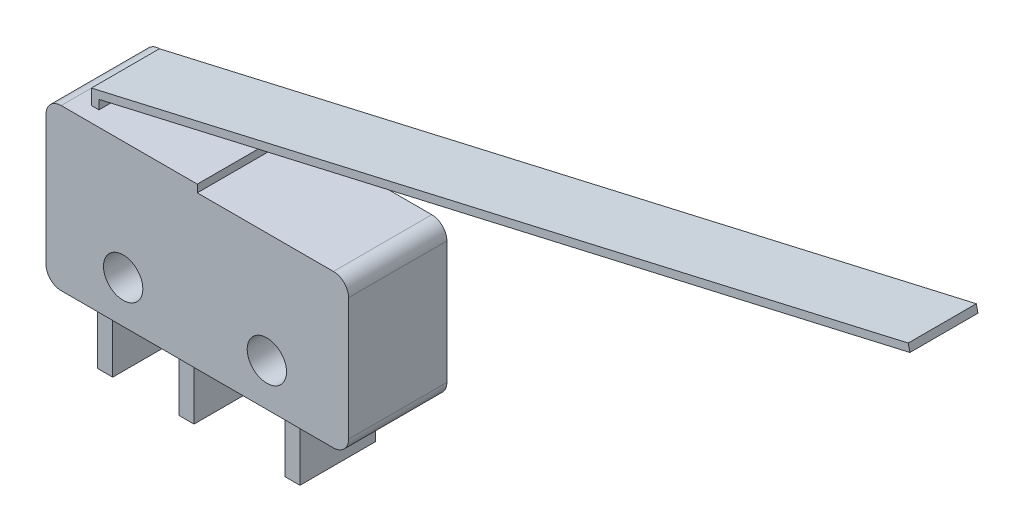
ISO-10303-21;
HEADER;
FILE_DESCRIPTION(('STEP AP214'),'2;1');
FILE_NAME('part.step','',(''),(''),'','','');
FILE_SCHEMA(('AUTOMOTIVE_DESIGN { 1 0 10303 214 1 1 1 1 }'));
ENDSEC;
DATA;
#1=APPLICATION_CONTEXT('core data for automotive mechanical design processes');
#2=APPLICATION_PROTOCOL_DEFINITION('international standard','automotive_design',2000,#1);
#3=PRODUCT_CONTEXT('',#1,'mechanical');
#4=PRODUCT('Part','Part','',(#3));
#5=PRODUCT_RELATED_PRODUCT_CATEGORY('part','',(#4));
#6=PRODUCT_DEFINITION_FORMATION('','',#4);
#7=PRODUCT_DEFINITION_CONTEXT('part definition',#1,'design');
#8=PRODUCT_DEFINITION('design','',#6,#7);
#9=PRODUCT_DEFINITION_SHAPE('','',#8);
#10=(LENGTH_UNIT() NAMED_UNIT(*) SI_UNIT(.MILLI.,.METRE.));
#11=(NAMED_UNIT(*) PLANE_ANGLE_UNIT() SI_UNIT($,.RADIAN.));
#12=(NAMED_UNIT(*) SI_UNIT($,.STERADIAN.) SOLID_ANGLE_UNIT());
#13=UNCERTAINTY_MEASURE_WITH_UNIT(LENGTH_MEASURE(1.E-05),#10,'distance_accuracy_value','');
#14=(GEOMETRIC_REPRESENTATION_CONTEXT(3) GLOBAL_UNCERTAINTY_ASSIGNED_CONTEXT((#13)) GLOBAL_UNIT_ASSIGNED_CONTEXT((#10,
#11,#12)) REPRESENTATION_CONTEXT('',''));
#15=CARTESIAN_POINT('',(0.,0.,0.));
#16=DIRECTION('',(0.,0.,1.));
#17=DIRECTION('',(1.,0.,0.));
#18=AXIS2_PLACEMENT_3D('',#15,#16,#17);
#19=CARTESIAN_POINT('',(0.,0.,6.5));
#20=DIRECTION('',(0.,1.,0.));
#21=DIRECTION('',(0.,0.,1.));
#22=AXIS2_PLACEMENT_3D('',#19,#20,#21);
#23=PLANE('',#22);
#24=DIRECTION('',(0.,0.,-1.));
#25=VECTOR('',#24,1.);
#26=CARTESIAN_POINT('',(8.0313704706211,0.,5.75));
#27=LINE('',#26,#25);
#28=CARTESIAN_POINT('',(8.0313704706211,0.,5.75));
#29=VERTEX_POINT('',#28);
#30=CARTESIAN_POINT('',(8.0313704706211,0.,0.75));
#31=VERTEX_POINT('',#30);
#32=EDGE_CURVE('E303',#29,#31,#27,.T.);
#33=ORIENTED_EDGE('',*,*,#32,.F.);
#34=DIRECTION('',(-1.,0.,0.));
#35=VECTOR('',#34,1.);
#36=CARTESIAN_POINT('',(8.0313704706211,0.,5.75));
#37=LINE('',#36,#35);
#38=CARTESIAN_POINT('',(9.0313704706211,0.,5.75));
#39=VERTEX_POINT('',#38);
#40=EDGE_CURVE('E290',#39,#29,#37,.T.);
#41=ORIENTED_EDGE('',*,*,#40,.F.);
#42=DIRECTION('',(0.,0.,1.));
#43=VECTOR('',#42,1.);
#44=CARTESIAN_POINT('',(9.0313704706211,0.,5.75));
#45=LINE('',#44,#43);
#46=CARTESIAN_POINT('',(9.0313704706211,0.,0.75));
#47=VERTEX_POINT('',#46);
#48=EDGE_CURVE('E294',#47,#39,#45,.T.);
#49=ORIENTED_EDGE('',*,*,#48,.F.);
#50=DIRECTION('',(1.,0.,0.));
#51=VECTOR('',#50,1.);
#52=CARTESIAN_POINT('',(8.0313704706211,0.,0.75));
#53=LINE('',#52,#51);
#54=EDGE_CURVE('E299',#31,#47,#53,.T.);
#55=ORIENTED_EDGE('',*,*,#54,.F.);
#56=EDGE_LOOP('',(#33,#41,#49,#55));
#57=FACE_BOUND('',#56,.T.);
#58=DIRECTION('',(1.,0.,0.));
#59=VECTOR('',#58,1.);
#60=CARTESIAN_POINT('',(0.,0.,6.5));
#61=LINE('',#60,#59);
#62=CARTESIAN_POINT('',(1.,0.,6.5));
#63=VERTEX_POINT('',#62);
#64=CARTESIAN_POINT('',(19.,0.,6.5));
#65=VERTEX_POINT('',#64);
#66=EDGE_CURVE('E450',#63,#65,#61,.T.);
#67=ORIENTED_EDGE('',*,*,#66,.F.);
#68=DIRECTION('',(0.,0.,-1.));
#69=VECTOR('',#68,1.);
#70=CARTESIAN_POINT('',(1.,0.,6.5));
#71=LINE('',#70,#69);
#72=CARTESIAN_POINT('',(1.,0.,0.));
#73=VERTEX_POINT('',#72);
#74=EDGE_CURVE('E534',#63,#73,#71,.T.);
#75=ORIENTED_EDGE('',*,*,#74,.T.);
#76=DIRECTION('',(1.,0.,0.));
#77=VECTOR('',#76,1.);
#78=CARTESIAN_POINT('',(0.,0.,0.));
#79=LINE('',#78,#77);
#80=CARTESIAN_POINT('',(19.,0.,0.));
#81=VERTEX_POINT('',#80);
#82=EDGE_CURVE('E473',#73,#81,#79,.T.);
#83=ORIENTED_EDGE('',*,*,#82,.T.);
#84=DIRECTION('',(0.,0.,-1.));
#85=VECTOR('',#84,1.);
#86=CARTESIAN_POINT('',(19.,0.,6.5));
#87=LINE('',#86,#85);
#88=EDGE_CURVE('E531',#81,#65,#87,.F.);
#89=ORIENTED_EDGE('',*,*,#88,.T.);
#90=EDGE_LOOP('',(#67,#75,#83,#89));
#91=FACE_BOUND('',#90,.T.);
#92=DIRECTION('',(0.,0.,-1.));
#93=VECTOR('',#92,1.);
#94=CARTESIAN_POINT('',(2.65900909777777,0.,5.75));
#95=LINE('',#94,#93);
#96=CARTESIAN_POINT('',(2.65900909777777,0.,5.75));
#97=VERTEX_POINT('',#96);
#98=CARTESIAN_POINT('',(2.65900909777777,0.,0.75));
#99=VERTEX_POINT('',#98);
#100=EDGE_CURVE('E307',#97,#99,#95,.T.);
#101=ORIENTED_EDGE('',*,*,#100,.F.);
#102=DIRECTION('',(-1.,0.,0.));
#103=VECTOR('',#102,1.);
#104=CARTESIAN_POINT('',(2.65900909777777,0.,5.75));
#105=LINE('',#104,#103);
#106=CARTESIAN_POINT('',(3.65900909777777,0.,5.75));
#107=VERTEX_POINT('',#106);
#108=EDGE_CURVE('E324',#107,#97,#105,.T.);
#109=ORIENTED_EDGE('',*,*,#108,.F.);
#110=DIRECTION('',(0.,0.,1.));
#111=VECTOR('',#110,1.);
#112=CARTESIAN_POINT('',(3.65900909777777,0.,5.75));
#113=LINE('',#112,#111);
#114=CARTESIAN_POINT('',(3.65900909777777,0.,0.75));
#115=VERTEX_POINT('',#114);
#116=EDGE_CURVE('E341',#115,#107,#113,.T.);
#117=ORIENTED_EDGE('',*,*,#116,.F.);
#118=DIRECTION('',(1.,0.,0.));
#119=VECTOR('',#118,1.);
#120=CARTESIAN_POINT('',(2.65900909777777,0.,0.75));
#121=LINE('',#120,#119);
#122=EDGE_CURVE('E337',#99,#115,#121,.T.);
#123=ORIENTED_EDGE('',*,*,#122,.F.);
#124=EDGE_LOOP('',(#101,#109,#117,#123));
#125=FACE_BOUND('',#124,.T.);
#126=DIRECTION('',(0.,0.,-1.));
#127=VECTOR('',#126,1.);
#128=CARTESIAN_POINT('',(15.0359206095109,0.,5.75));
#129=LINE('',#128,#127);
#130=CARTESIAN_POINT('',(15.0359206095109,0.,5.75));
#131=VERTEX_POINT('',#130);
#132=CARTESIAN_POINT('',(15.0359206095109,0.,0.75));
#133=VERTEX_POINT('',#132);
#134=EDGE_CURVE('E229',#131,#133,#129,.T.);
#135=ORIENTED_EDGE('',*,*,#134,.F.);
#136=DIRECTION('',(-1.,0.,0.));
#137=VECTOR('',#136,1.);
#138=CARTESIAN_POINT('',(15.0359206095109,0.,5.75));
#139=LINE('',#138,#137);
#140=CARTESIAN_POINT('',(16.0359206095109,0.,5.75));
#141=VERTEX_POINT('',#140);
#142=EDGE_CURVE('E231',#141,#131,#139,.T.);
#143=ORIENTED_EDGE('',*,*,#142,.F.);
#144=DIRECTION('',(0.,0.,1.));
#145=VECTOR('',#144,1.);
#146=CARTESIAN_POINT('',(16.0359206095109,0.,5.75));
#147=LINE('',#146,#145);
#148=CARTESIAN_POINT('',(16.0359206095109,0.,0.75));
#149=VERTEX_POINT('',#148);
#150=EDGE_CURVE('E68',#149,#141,#147,.T.);
#151=ORIENTED_EDGE('',*,*,#150,.F.);
#152=DIRECTION('',(1.,0.,0.));
#153=VECTOR('',#152,1.);
#154=CARTESIAN_POINT('',(15.0359206095109,0.,0.75));
#155=LINE('',#154,#153);
#156=EDGE_CURVE('E63',#133,#149,#155,.T.);
#157=ORIENTED_EDGE('',*,*,#156,.F.);
#158=EDGE_LOOP('',(#135,#143,#151,#157));
#159=FACE_BOUND('',#158,.T.);
#160=ADVANCED_FACE('F47',(#57,#91,#125,#159),#23,.F.);
#161=CARTESIAN_POINT('',(0.,0.,6.5));
#162=DIRECTION('',(1.,0.,0.));
#163=DIRECTION('',(0.,0.,-1.));
#164=AXIS2_PLACEMENT_3D('',#161,#162,#163);
#165=PLANE('',#164);
#166=DIRECTION('',(0.,-1.,0.));
#167=VECTOR('',#166,1.);
#168=CARTESIAN_POINT('',(0.,0.,6.5));
#169=LINE('',#168,#167);
#170=CARTESIAN_POINT('',(0.,9.6,6.5));
#171=VERTEX_POINT('',#170);
#172=CARTESIAN_POINT('',(0.,1.,6.5));
#173=VERTEX_POINT('',#172);
#174=EDGE_CURVE('E446',#171,#173,#169,.T.);
#175=ORIENTED_EDGE('',*,*,#174,.F.);
#176=DIRECTION('',(0.,0.,-1.));
#177=VECTOR('',#176,1.);
#178=CARTESIAN_POINT('',(0.,9.6,6.5));
#179=LINE('',#178,#177);
#180=CARTESIAN_POINT('',(0.,9.6,0.));
#181=VERTEX_POINT('',#180);
#182=EDGE_CURVE('E500',#171,#181,#179,.T.);
#183=ORIENTED_EDGE('',*,*,#182,.T.);
#184=DIRECTION('',(0.,-1.,0.));
#185=VECTOR('',#184,1.);
#186=CARTESIAN_POINT('',(0.,0.,0.));
#187=LINE('',#186,#185);
#188=CARTESIAN_POINT('',(0.,1.,0.));
#189=VERTEX_POINT('',#188);
#190=EDGE_CURVE('E445',#181,#189,#187,.T.);
#191=ORIENTED_EDGE('',*,*,#190,.T.);
#192=DIRECTION('',(0.,0.,-1.));
#193=VECTOR('',#192,1.);
#194=CARTESIAN_POINT('',(0.,1.,6.5));
#195=LINE('',#194,#193);
#196=EDGE_CURVE('E497',#189,#173,#195,.F.);
#197=ORIENTED_EDGE('',*,*,#196,.T.);
#198=EDGE_LOOP('',(#175,#183,#191,#197));
#199=FACE_BOUND('',#198,.T.);
#200=ADVANCED_FACE('F577',(#199),#165,.F.);
#201=CARTESIAN_POINT('',(20.,0.,6.5));
#202=DIRECTION('',(-1.,0.,0.));
#203=DIRECTION('',(0.,0.,1.));
#204=AXIS2_PLACEMENT_3D('',#201,#202,#203);
#205=PLANE('',#204);
#206=DIRECTION('',(0.,1.,0.));
#207=VECTOR('',#206,1.);
#208=CARTESIAN_POINT('',(20.,0.,6.5));
#209=LINE('',#208,#207);
#210=CARTESIAN_POINT('',(20.,1.,6.5));
#211=VERTEX_POINT('',#210);
#212=CARTESIAN_POINT('',(20.,9.1,6.5));
#213=VERTEX_POINT('',#212);
#214=EDGE_CURVE('E455',#211,#213,#209,.T.);
#215=ORIENTED_EDGE('',*,*,#214,.F.);
#216=DIRECTION('',(0.,0.,-1.));
#217=VECTOR('',#216,1.);
#218=CARTESIAN_POINT('',(20.,1.,6.5));
#219=LINE('',#218,#217);
#220=CARTESIAN_POINT('',(20.,1.,0.));
#221=VERTEX_POINT('',#220);
#222=EDGE_CURVE('E56',#211,#221,#219,.T.);
#223=ORIENTED_EDGE('',*,*,#222,.T.);
#224=DIRECTION('',(0.,1.,0.));
#225=VECTOR('',#224,1.);
#226=CARTESIAN_POINT('',(20.,0.,0.));
#227=LINE('',#226,#225);
#228=CARTESIAN_POINT('',(20.,9.1,0.));
#229=VERTEX_POINT('',#228);
#230=EDGE_CURVE('E477',#221,#229,#227,.T.);
#231=ORIENTED_EDGE('',*,*,#230,.T.);
#232=DIRECTION('',(0.,0.,-1.));
#233=VECTOR('',#232,1.);
#234=CARTESIAN_POINT('',(20.,9.1,6.5));
#235=LINE('',#234,#233);
#236=EDGE_CURVE('E538',#229,#213,#235,.F.);
#237=ORIENTED_EDGE('',*,*,#236,.T.);
#238=EDGE_LOOP('',(#215,#223,#231,#237));
#239=FACE_BOUND('',#238,.T.);
#240=ADVANCED_FACE('F546',(#239),#205,.F.);
#241=CARTESIAN_POINT('',(10.,10.1,6.5));
#242=DIRECTION('',(0.,-1.,0.));
#243=DIRECTION('',(0.,0.,-1.));
#244=AXIS2_PLACEMENT_3D('',#241,#242,#243);
#245=PLANE('',#244);
#246=DIRECTION('',(-1.,0.,0.));
#247=VECTOR('',#246,1.);
#248=CARTESIAN_POINT('',(10.,10.1,6.5));
#249=LINE('',#248,#247);
#250=CARTESIAN_POINT('',(19.,10.1,6.5));
#251=VERTEX_POINT('',#250);
#252=CARTESIAN_POINT('',(10.,10.1,6.5));
#253=VERTEX_POINT('',#252);
#254=EDGE_CURVE('E459',#251,#253,#249,.T.);
#255=ORIENTED_EDGE('',*,*,#254,.F.);
#256=DIRECTION('',(0.,0.,-1.));
#257=VECTOR('',#256,1.);
#258=CARTESIAN_POINT('',(19.,10.1,6.5));
#259=LINE('',#258,#257);
#260=CARTESIAN_POINT('',(19.,10.1,0.));
#261=VERTEX_POINT('',#260);
#262=EDGE_CURVE('E12',#251,#261,#259,.T.);
#263=ORIENTED_EDGE('',*,*,#262,.T.);
#264=DIRECTION('',(-1.,0.,0.));
#265=VECTOR('',#264,1.);
#266=CARTESIAN_POINT('',(10.,10.1,0.));
#267=LINE('',#266,#265);
#268=CARTESIAN_POINT('',(10.,10.1,0.));
#269=VERTEX_POINT('',#268);
#270=EDGE_CURVE('E481',#261,#269,#267,.T.);
#271=ORIENTED_EDGE('',*,*,#270,.T.);
#272=DIRECTION('',(0.,0.,-1.));
#273=VECTOR('',#272,1.);
#274=CARTESIAN_POINT('',(10.,10.1,6.5));
#275=LINE('',#274,#273);
#276=EDGE_CURVE('E493',#253,#269,#275,.T.);
#277=ORIENTED_EDGE('',*,*,#276,.F.);
#278=EDGE_LOOP('',(#255,#263,#271,#277));
#279=FACE_BOUND('',#278,.T.);
#280=ADVANCED_FACE('F561',(#279),#245,.F.);
#281=CARTESIAN_POINT('',(10.,10.6,6.5));
#282=DIRECTION('',(-1.,0.,0.));
#283=DIRECTION('',(0.,0.,1.));
#284=AXIS2_PLACEMENT_3D('',#281,#282,#283);
#285=PLANE('',#284);
#286=DIRECTION('',(0.,1.,0.));
#287=VECTOR('',#286,1.);
#288=CARTESIAN_POINT('',(10.,10.6,0.));
#289=LINE('',#288,#287);
#290=CARTESIAN_POINT('',(10.,10.6,0.));
#291=VERTEX_POINT('',#290);
#292=EDGE_CURVE('E484',#269,#291,#289,.T.);
#293=ORIENTED_EDGE('',*,*,#292,.T.);
#294=DIRECTION('',(0.,0.,-1.));
#295=VECTOR('',#294,1.);
#296=CARTESIAN_POINT('',(10.,10.6,6.5));
#297=LINE('',#296,#295);
#298=CARTESIAN_POINT('',(10.,10.6,6.5));
#299=VERTEX_POINT('',#298);
#300=EDGE_CURVE('E469',#299,#291,#297,.T.);
#301=ORIENTED_EDGE('',*,*,#300,.F.);
#302=DIRECTION('',(0.,1.,0.));
#303=VECTOR('',#302,1.);
#304=CARTESIAN_POINT('',(10.,10.6,6.5));
#305=LINE('',#304,#303);
#306=EDGE_CURVE('E462',#253,#299,#305,.T.);
#307=ORIENTED_EDGE('',*,*,#306,.F.);
#308=ORIENTED_EDGE('',*,*,#276,.T.);
#309=EDGE_LOOP('',(#293,#301,#307,#308));
#310=FACE_BOUND('',#309,.T.);
#311=ADVANCED_FACE('F590',(#310),#285,.F.);
#312=CARTESIAN_POINT('',(0.,10.6,6.5));
#313=DIRECTION('',(0.,-1.,0.));
#314=DIRECTION('',(0.,0.,-1.));
#315=AXIS2_PLACEMENT_3D('',#312,#313,#314);
#316=PLANE('',#315);
#317=DIRECTION('',(1.,0.,0.));
#318=VECTOR('',#317,1.);
#319=CARTESIAN_POINT('',(2.,10.6,1.));
#320=LINE('',#319,#318);
#321=CARTESIAN_POINT('',(2.,10.6,1.));
#322=VERTEX_POINT('',#321);
#323=CARTESIAN_POINT('',(2.5,10.6,1.));
#324=VERTEX_POINT('',#323);
#325=EDGE_CURVE('E392',#322,#324,#320,.T.);
#326=ORIENTED_EDGE('',*,*,#325,.T.);
#327=DIRECTION('',(0.,0.,1.));
#328=VECTOR('',#327,1.);
#329=CARTESIAN_POINT('',(2.5,10.6,-55.7391865797012));
#330=LINE('',#329,#328);
#331=CARTESIAN_POINT('',(2.5,10.6,5.5));
#332=VERTEX_POINT('',#331);
#333=EDGE_CURVE('E396',#324,#332,#330,.T.);
#334=ORIENTED_EDGE('',*,*,#333,.T.);
#335=DIRECTION('',(1.,0.,0.));
#336=VECTOR('',#335,1.);
#337=CARTESIAN_POINT('',(2.,10.6,5.5));
#338=LINE('',#337,#336);
#339=CARTESIAN_POINT('',(2.,10.6,5.5));
#340=VERTEX_POINT('',#339);
#341=EDGE_CURVE('E363',#340,#332,#338,.T.);
#342=ORIENTED_EDGE('',*,*,#341,.F.);
#343=DIRECTION('',(0.,0.,1.));
#344=VECTOR('',#343,1.);
#345=CARTESIAN_POINT('',(2.,10.6,-55.7391865797012));
#346=LINE('',#345,#344);
#347=EDGE_CURVE('E397',#322,#340,#346,.T.);
#348=ORIENTED_EDGE('',*,*,#347,.F.);
#349=EDGE_LOOP('',(#326,#334,#342,#348));
#350=FACE_BOUND('',#349,.T.);
#351=DIRECTION('',(-1.,0.,0.));
#352=VECTOR('',#351,1.);
#353=CARTESIAN_POINT('',(0.,10.6,0.));
#354=LINE('',#353,#352);
#355=CARTESIAN_POINT('',(1.,10.6,0.));
#356=VERTEX_POINT('',#355);
#357=EDGE_CURVE('E451',#291,#356,#354,.T.);
#358=ORIENTED_EDGE('',*,*,#357,.T.);
#359=DIRECTION('',(0.,0.,-1.));
#360=VECTOR('',#359,1.);
#361=CARTESIAN_POINT('',(1.,10.6,6.5));
#362=LINE('',#361,#360);
#363=CARTESIAN_POINT('',(1.,10.6,6.5));
#364=VERTEX_POINT('',#363);
#365=EDGE_CURVE('E516',#356,#364,#362,.F.);
#366=ORIENTED_EDGE('',*,*,#365,.T.);
#367=DIRECTION('',(-1.,0.,0.));
#368=VECTOR('',#367,1.);
#369=CARTESIAN_POINT('',(0.,10.6,6.5));
#370=LINE('',#369,#368);
#371=EDGE_CURVE('E465',#299,#364,#370,.T.);
#372=ORIENTED_EDGE('',*,*,#371,.F.);
#373=ORIENTED_EDGE('',*,*,#300,.T.);
#374=EDGE_LOOP('',(#358,#366,#372,#373));
#375=FACE_BOUND('',#374,.T.);
#376=ADVANCED_FACE('F587',(#350,#375),#316,.F.);
#377=CARTESIAN_POINT('',(0.,0.,6.5));
#378=DIRECTION('',(0.,0.,-1.));
#379=DIRECTION('',(-1.,0.,0.));
#380=AXIS2_PLACEMENT_3D('',#377,#378,#379);
#381=PLANE('',#380);
#382=CARTESIAN_POINT('',(5.1,2.8,6.5));
#383=DIRECTION('',(0.,0.,1.));
#384=DIRECTION('',(1.,0.,0.));
#385=AXIS2_PLACEMENT_3D('',#382,#383,#384);
#386=CIRCLE('',#385,1.3);
#387=CARTESIAN_POINT('',(6.4,2.8,6.5));
#388=VERTEX_POINT('',#387);
#389=EDGE_CURVE('E429',#388,#388,#386,.T.);
#390=ORIENTED_EDGE('',*,*,#389,.F.);
#391=EDGE_LOOP('',(#390));
#392=FACE_BOUND('',#391,.T.);
#393=CARTESIAN_POINT('',(14.6,2.8,6.5));
#394=DIRECTION('',(0.,0.,1.));
#395=DIRECTION('',(1.,0.,0.));
#396=AXIS2_PLACEMENT_3D('',#393,#394,#395);
#397=CIRCLE('',#396,1.3);
#398=CARTESIAN_POINT('',(15.9,2.8,6.5));
#399=VERTEX_POINT('',#398);
#400=EDGE_CURVE('E437',#399,#399,#397,.T.);
#401=ORIENTED_EDGE('',*,*,#400,.F.);
#402=EDGE_LOOP('',(#401));
#403=FACE_BOUND('',#402,.T.);
#404=ORIENTED_EDGE('',*,*,#371,.T.);
#405=CARTESIAN_POINT('',(1.,9.6,6.5));
#406=DIRECTION('',(0.,0.,-1.));
#407=DIRECTION('',(-1.,0.,0.));
#408=AXIS2_PLACEMENT_3D('',#405,#406,#407);
#409=CIRCLE('',#408,1.);
#410=EDGE_CURVE('E528',#364,#171,#409,.F.);
#411=ORIENTED_EDGE('',*,*,#410,.T.);
#412=ORIENTED_EDGE('',*,*,#174,.T.);
#413=CARTESIAN_POINT('',(1.,1.,6.5));
#414=DIRECTION('',(0.,0.,-1.));
#415=DIRECTION('',(-1.,0.,0.));
#416=AXIS2_PLACEMENT_3D('',#413,#414,#415);
#417=CIRCLE('',#416,1.);
#418=EDGE_CURVE('E525',#173,#63,#417,.F.);
#419=ORIENTED_EDGE('',*,*,#418,.T.);
#420=ORIENTED_EDGE('',*,*,#66,.T.);
#421=CARTESIAN_POINT('',(19.,1.,6.5));
#422=DIRECTION('',(0.,0.,-1.));
#423=DIRECTION('',(-1.,0.,0.));
#424=AXIS2_PLACEMENT_3D('',#421,#422,#423);
#425=CIRCLE('',#424,1.);
#426=EDGE_CURVE('E522',#65,#211,#425,.F.);
#427=ORIENTED_EDGE('',*,*,#426,.T.);
#428=ORIENTED_EDGE('',*,*,#214,.T.);
#429=CARTESIAN_POINT('',(19.,9.1,6.5));
#430=DIRECTION('',(0.,0.,-1.));
#431=DIRECTION('',(-1.,0.,0.));
#432=AXIS2_PLACEMENT_3D('',#429,#430,#431);
#433=CIRCLE('',#432,1.);
#434=EDGE_CURVE('E519',#213,#251,#433,.F.);
#435=ORIENTED_EDGE('',*,*,#434,.T.);
#436=ORIENTED_EDGE('',*,*,#254,.T.);
#437=ORIENTED_EDGE('',*,*,#306,.T.);
#438=EDGE_LOOP('',(#404,#411,#412,#419,#420,#427,#428,#435,#436,#437));
#439=FACE_BOUND('',#438,.T.);
#440=ADVANCED_FACE('F565',(#392,#403,#439),#381,.F.);
#441=CARTESIAN_POINT('',(0.,0.,0.));
#442=DIRECTION('',(0.,0.,-1.));
#443=DIRECTION('',(-1.,0.,0.));
#444=AXIS2_PLACEMENT_3D('',#441,#442,#443);
#445=PLANE('',#444);
#446=CARTESIAN_POINT('',(5.1,2.8,0.));
#447=DIRECTION('',(0.,0.,1.));
#448=DIRECTION('',(1.,0.,0.));
#449=AXIS2_PLACEMENT_3D('',#446,#447,#448);
#450=CIRCLE('',#449,1.3);
#451=CARTESIAN_POINT('',(6.4,2.8,0.));
#452=VERTEX_POINT('',#451);
#453=EDGE_CURVE('E433',#452,#452,#450,.T.);
#454=ORIENTED_EDGE('',*,*,#453,.T.);
#455=EDGE_LOOP('',(#454));
#456=FACE_BOUND('',#455,.T.);
#457=CARTESIAN_POINT('',(14.6,2.8,0.));
#458=DIRECTION('',(0.,0.,1.));
#459=DIRECTION('',(1.,0.,0.));
#460=AXIS2_PLACEMENT_3D('',#457,#458,#459);
#461=CIRCLE('',#460,1.3);
#462=CARTESIAN_POINT('',(15.9,2.8,0.));
#463=VERTEX_POINT('',#462);
#464=EDGE_CURVE('E441',#463,#463,#461,.T.);
#465=ORIENTED_EDGE('',*,*,#464,.T.);
#466=EDGE_LOOP('',(#465));
#467=FACE_BOUND('',#466,.T.);
#468=ORIENTED_EDGE('',*,*,#190,.F.);
#469=CARTESIAN_POINT('',(1.,9.6,0.));
#470=DIRECTION('',(0.,0.,-1.));
#471=DIRECTION('',(-1.,0.,0.));
#472=AXIS2_PLACEMENT_3D('',#469,#470,#471);
#473=CIRCLE('',#472,1.);
#474=EDGE_CURVE('E513',#181,#356,#473,.T.);
#475=ORIENTED_EDGE('',*,*,#474,.T.);
#476=ORIENTED_EDGE('',*,*,#357,.F.);
#477=ORIENTED_EDGE('',*,*,#292,.F.);
#478=ORIENTED_EDGE('',*,*,#270,.F.);
#479=CARTESIAN_POINT('',(19.,9.1,0.));
#480=DIRECTION('',(0.,0.,-1.));
#481=DIRECTION('',(-1.,0.,0.));
#482=AXIS2_PLACEMENT_3D('',#479,#480,#481);
#483=CIRCLE('',#482,1.);
#484=EDGE_CURVE('E504',#261,#229,#483,.T.);
#485=ORIENTED_EDGE('',*,*,#484,.T.);
#486=ORIENTED_EDGE('',*,*,#230,.F.);
#487=CARTESIAN_POINT('',(19.,1.,0.));
#488=DIRECTION('',(0.,0.,-1.));
#489=DIRECTION('',(-1.,0.,0.));
#490=AXIS2_PLACEMENT_3D('',#487,#488,#489);
#491=CIRCLE('',#490,1.);
#492=EDGE_CURVE('E507',#221,#81,#491,.T.);
#493=ORIENTED_EDGE('',*,*,#492,.T.);
#494=ORIENTED_EDGE('',*,*,#82,.F.);
#495=CARTESIAN_POINT('',(1.,1.,0.));
#496=DIRECTION('',(0.,0.,-1.));
#497=DIRECTION('',(-1.,0.,0.));
#498=AXIS2_PLACEMENT_3D('',#495,#496,#497);
#499=CIRCLE('',#498,1.);
#500=EDGE_CURVE('E510',#73,#189,#499,.T.);
#501=ORIENTED_EDGE('',*,*,#500,.T.);
#502=EDGE_LOOP('',(#468,#475,#476,#477,#478,#485,#486,#493,#494,#501));
#503=FACE_BOUND('',#502,.T.);
#504=ADVANCED_FACE('F552',(#456,#467,#503),#445,.T.);
#505=CARTESIAN_POINT('',(1.,9.6,6.5));
#506=DIRECTION('',(0.,0.,-1.));
#507=DIRECTION('',(-1.,0.,0.));
#508=AXIS2_PLACEMENT_3D('',#505,#506,#507);
#509=CYLINDRICAL_SURFACE('',#508,1.);
#510=ORIENTED_EDGE('',*,*,#410,.F.);
#511=ORIENTED_EDGE('',*,*,#365,.F.);
#512=ORIENTED_EDGE('',*,*,#474,.F.);
#513=ORIENTED_EDGE('',*,*,#182,.F.);
#514=EDGE_LOOP('',(#510,#511,#512,#513));
#515=FACE_BOUND('',#514,.T.);
#516=ADVANCED_FACE('F583',(#515),#509,.T.);
#517=CARTESIAN_POINT('',(1.,1.,6.5));
#518=DIRECTION('',(0.,0.,-1.));
#519=DIRECTION('',(-1.,0.,0.));
#520=AXIS2_PLACEMENT_3D('',#517,#518,#519);
#521=CYLINDRICAL_SURFACE('',#520,1.);
#522=ORIENTED_EDGE('',*,*,#418,.F.);
#523=ORIENTED_EDGE('',*,*,#196,.F.);
#524=ORIENTED_EDGE('',*,*,#500,.F.);
#525=ORIENTED_EDGE('',*,*,#74,.F.);
#526=EDGE_LOOP('',(#522,#523,#524,#525));
#527=FACE_BOUND('',#526,.T.);
#528=ADVANCED_FACE('F580',(#527),#521,.T.);
#529=CARTESIAN_POINT('',(19.,1.,6.5));
#530=DIRECTION('',(0.,0.,-1.));
#531=DIRECTION('',(-1.,0.,0.));
#532=AXIS2_PLACEMENT_3D('',#529,#530,#531);
#533=CYLINDRICAL_SURFACE('',#532,1.);
#534=ORIENTED_EDGE('',*,*,#426,.F.);
#535=ORIENTED_EDGE('',*,*,#88,.F.);
#536=ORIENTED_EDGE('',*,*,#492,.F.);
#537=ORIENTED_EDGE('',*,*,#222,.F.);
#538=EDGE_LOOP('',(#534,#535,#536,#537));
#539=FACE_BOUND('',#538,.T.);
#540=ADVANCED_FACE('F569',(#539),#533,.T.);
#541=CARTESIAN_POINT('',(19.,9.1,6.5));
#542=DIRECTION('',(0.,0.,-1.));
#543=DIRECTION('',(-1.,0.,0.));
#544=AXIS2_PLACEMENT_3D('',#541,#542,#543);
#545=CYLINDRICAL_SURFACE('',#544,1.);
#546=ORIENTED_EDGE('',*,*,#434,.F.);
#547=ORIENTED_EDGE('',*,*,#236,.F.);
#548=ORIENTED_EDGE('',*,*,#484,.F.);
#549=ORIENTED_EDGE('',*,*,#262,.F.);
#550=EDGE_LOOP('',(#546,#547,#548,#549));
#551=FACE_BOUND('',#550,.T.);
#552=ADVANCED_FACE('F49',(#551),#545,.T.);
#553=CARTESIAN_POINT('',(14.6,2.8,6.5));
#554=DIRECTION('',(0.,0.,1.));
#555=DIRECTION('',(1.,0.,0.));
#556=AXIS2_PLACEMENT_3D('',#553,#554,#555);
#557=CYLINDRICAL_SURFACE('',#556,1.3);
#558=ORIENTED_EDGE('',*,*,#464,.F.);
#559=EDGE_LOOP('',(#558));
#560=FACE_BOUND('',#559,.T.);
#561=ORIENTED_EDGE('',*,*,#400,.T.);
#562=EDGE_LOOP('',(#561));
#563=FACE_BOUND('',#562,.T.);
#564=ADVANCED_FACE('F618',(#560,#563),#557,.F.);
#565=CARTESIAN_POINT('',(5.1,2.8,6.5));
#566=DIRECTION('',(0.,0.,1.));
#567=DIRECTION('',(1.,0.,0.));
#568=AXIS2_PLACEMENT_3D('',#565,#566,#567);
#569=CYLINDRICAL_SURFACE('',#568,1.3);
#570=ORIENTED_EDGE('',*,*,#453,.F.);
#571=EDGE_LOOP('',(#570));
#572=FACE_BOUND('',#571,.T.);
#573=ORIENTED_EDGE('',*,*,#389,.T.);
#574=EDGE_LOOP('',(#573));
#575=FACE_BOUND('',#574,.T.);
#576=ADVANCED_FACE('F623',(#572,#575),#569,.F.);
#577=CARTESIAN_POINT('',(0.,0.,1.));
#578=DIRECTION('',(0.,0.,-1.));
#579=DIRECTION('',(-1.,0.,0.));
#580=AXIS2_PLACEMENT_3D('',#577,#578,#579);
#581=PLANE('',#580);
#582=ORIENTED_EDGE('',*,*,#325,.F.);
#583=DIRECTION('',(0.,-1.,0.));
#584=VECTOR('',#583,1.);
#585=CARTESIAN_POINT('',(2.,11.6,1.));
#586=LINE('',#585,#584);
#587=CARTESIAN_POINT('',(2.,11.6,1.));
#588=VERTEX_POINT('',#587);
#589=EDGE_CURVE('E398',#588,#322,#586,.T.);
#590=ORIENTED_EDGE('',*,*,#589,.F.);
#591=DIRECTION('',(-0.974627272780493,-0.223834043774532,0.));
#592=VECTOR('',#591,1.);
#593=CARTESIAN_POINT('',(55.9925829810398,24.,1.));
#594=LINE('',#593,#592);
#595=CARTESIAN_POINT('',(55.9925829810398,24.,1.));
#596=VERTEX_POINT('',#595);
#597=EDGE_CURVE('E402',#596,#588,#594,.T.);
#598=ORIENTED_EDGE('',*,*,#597,.F.);
#599=DIRECTION('',(-0.223834043774532,0.974627272780493,0.));
#600=VECTOR('',#599,1.);
#601=CARTESIAN_POINT('',(56.1045000029271,23.5126863636098,1.));
#602=LINE('',#601,#600);
#603=CARTESIAN_POINT('',(56.1045000029271,23.5126863636098,1.));
#604=VERTEX_POINT('',#603);
#605=EDGE_CURVE('E407',#604,#596,#602,.T.);
#606=ORIENTED_EDGE('',*,*,#605,.F.);
#607=DIRECTION('',(0.974627272780493,0.223834043774532,0.));
#608=VECTOR('',#607,1.);
#609=CARTESIAN_POINT('',(2.5,11.2018139560105,1.));
#610=LINE('',#609,#608);
#611=CARTESIAN_POINT('',(2.5,11.2018139560105,1.));
#612=VERTEX_POINT('',#611);
#613=EDGE_CURVE('E412',#612,#604,#610,.T.);
#614=ORIENTED_EDGE('',*,*,#613,.F.);
#615=DIRECTION('',(0.,1.,0.));
#616=VECTOR('',#615,1.);
#617=CARTESIAN_POINT('',(2.5,10.6,1.));
#618=LINE('',#617,#616);
#619=EDGE_CURVE('E368',#324,#612,#618,.T.);
#620=ORIENTED_EDGE('',*,*,#619,.F.);
#621=EDGE_LOOP('',(#582,#590,#598,#606,#614,#620));
#622=FACE_BOUND('',#621,.T.);
#623=ADVANCED_FACE('F630',(#622),#581,.T.);
#624=CARTESIAN_POINT('',(0.,0.,5.5));
#625=DIRECTION('',(0.,0.,1.));
#626=DIRECTION('',(1.,0.,0.));
#627=AXIS2_PLACEMENT_3D('',#624,#625,#626);
#628=PLANE('',#627);
#629=ORIENTED_EDGE('',*,*,#341,.T.);
#630=DIRECTION('',(0.,1.,0.));
#631=VECTOR('',#630,1.);
#632=CARTESIAN_POINT('',(2.5,10.6,5.5));
#633=LINE('',#632,#631);
#634=CARTESIAN_POINT('',(2.5,11.2018139560105,5.5));
#635=VERTEX_POINT('',#634);
#636=EDGE_CURVE('E381',#332,#635,#633,.T.);
#637=ORIENTED_EDGE('',*,*,#636,.T.);
#638=DIRECTION('',(0.974627272780493,0.223834043774532,0.));
#639=VECTOR('',#638,1.);
#640=CARTESIAN_POINT('',(2.5,11.2018139560105,5.5));
#641=LINE('',#640,#639);
#642=CARTESIAN_POINT('',(56.1045000029271,23.5126863636098,5.5));
#643=VERTEX_POINT('',#642);
#644=EDGE_CURVE('E377',#635,#643,#641,.T.);
#645=ORIENTED_EDGE('',*,*,#644,.T.);
#646=DIRECTION('',(-0.223834043774532,0.974627272780493,0.));
#647=VECTOR('',#646,1.);
#648=CARTESIAN_POINT('',(56.1045000029271,23.5126863636098,5.5));
#649=LINE('',#648,#647);
#650=CARTESIAN_POINT('',(55.9925829810398,24.,5.5));
#651=VERTEX_POINT('',#650);
#652=EDGE_CURVE('E373',#643,#651,#649,.T.);
#653=ORIENTED_EDGE('',*,*,#652,.T.);
#654=DIRECTION('',(-0.974627272780493,-0.223834043774532,0.));
#655=VECTOR('',#654,1.);
#656=CARTESIAN_POINT('',(55.9925829810398,24.,5.5));
#657=LINE('',#656,#655);
#658=CARTESIAN_POINT('',(2.,11.6,5.5));
#659=VERTEX_POINT('',#658);
#660=EDGE_CURVE('E369',#651,#659,#657,.T.);
#661=ORIENTED_EDGE('',*,*,#660,.T.);
#662=DIRECTION('',(0.,-1.,0.));
#663=VECTOR('',#662,1.);
#664=CARTESIAN_POINT('',(2.,11.6,5.5));
#665=LINE('',#664,#663);
#666=EDGE_CURVE('E364',#659,#340,#665,.T.);
#667=ORIENTED_EDGE('',*,*,#666,.T.);
#668=EDGE_LOOP('',(#629,#637,#645,#653,#661,#667));
#669=FACE_BOUND('',#668,.T.);
#670=ADVANCED_FACE('F721',(#669),#628,.T.);
#671=CARTESIAN_POINT('',(2.5,10.6,-55.7391865797012));
#672=DIRECTION('',(1.,0.,0.));
#673=DIRECTION('',(0.,1.,0.));
#674=AXIS2_PLACEMENT_3D('',#671,#672,#673);
#675=PLANE('',#674);
#676=ORIENTED_EDGE('',*,*,#333,.F.);
#677=ORIENTED_EDGE('',*,*,#619,.T.);
#678=DIRECTION('',(0.,0.,1.));
#679=VECTOR('',#678,1.);
#680=CARTESIAN_POINT('',(2.5,11.2018139560105,-55.7391865797012));
#681=LINE('',#680,#679);
#682=EDGE_CURVE('E391',#612,#635,#681,.T.);
#683=ORIENTED_EDGE('',*,*,#682,.T.);
#684=ORIENTED_EDGE('',*,*,#636,.F.);
#685=EDGE_LOOP('',(#676,#677,#683,#684));
#686=FACE_BOUND('',#685,.T.);
#687=ADVANCED_FACE('F730',(#686),#675,.T.);
#688=CARTESIAN_POINT('',(2.5,11.2018139560105,-55.7391865797012));
#689=DIRECTION('',(0.223834043774532,-0.974627272780493,0.));
#690=DIRECTION('',(0.974627272780493,0.223834043774532,0.));
#691=AXIS2_PLACEMENT_3D('',#688,#689,#690);
#692=PLANE('',#691);
#693=ORIENTED_EDGE('',*,*,#682,.F.);
#694=ORIENTED_EDGE('',*,*,#613,.T.);
#695=DIRECTION('',(0.,0.,1.));
#696=VECTOR('',#695,1.);
#697=CARTESIAN_POINT('',(56.1045000029271,23.5126863636098,-55.7391865797012));
#698=LINE('',#697,#696);
#699=EDGE_CURVE('E411',#604,#643,#698,.T.);
#700=ORIENTED_EDGE('',*,*,#699,.T.);
#701=ORIENTED_EDGE('',*,*,#644,.F.);
#702=EDGE_LOOP('',(#693,#694,#700,#701));
#703=FACE_BOUND('',#702,.T.);
#704=ADVANCED_FACE('F740',(#703),#692,.T.);
#705=CARTESIAN_POINT('',(56.1045000029271,23.5126863636098,-55.7391865797012));
#706=DIRECTION('',(0.974627272780493,0.223834043774532,0.));
#707=DIRECTION('',(-0.223834043774532,0.974627272780493,0.));
#708=AXIS2_PLACEMENT_3D('',#705,#706,#707);
#709=PLANE('',#708);
#710=ORIENTED_EDGE('',*,*,#699,.F.);
#711=ORIENTED_EDGE('',*,*,#605,.T.);
#712=DIRECTION('',(0.,0.,1.));
#713=VECTOR('',#712,1.);
#714=CARTESIAN_POINT('',(55.9925829810398,24.,-55.7391865797012));
#715=LINE('',#714,#713);
#716=EDGE_CURVE('E406',#596,#651,#715,.T.);
#717=ORIENTED_EDGE('',*,*,#716,.T.);
#718=ORIENTED_EDGE('',*,*,#652,.F.);
#719=EDGE_LOOP('',(#710,#711,#717,#718));
#720=FACE_BOUND('',#719,.T.);
#721=ADVANCED_FACE('F750',(#720),#709,.T.);
#722=CARTESIAN_POINT('',(55.9925829810398,24.,-55.7391865797012));
#723=DIRECTION('',(-0.223834043774532,0.974627272780493,0.));
#724=DIRECTION('',(-0.974627272780493,-0.223834043774532,0.));
#725=AXIS2_PLACEMENT_3D('',#722,#723,#724);
#726=PLANE('',#725);
#727=ORIENTED_EDGE('',*,*,#716,.F.);
#728=ORIENTED_EDGE('',*,*,#597,.T.);
#729=DIRECTION('',(0.,0.,1.));
#730=VECTOR('',#729,1.);
#731=CARTESIAN_POINT('',(2.,11.6,-55.7391865797012));
#732=LINE('',#731,#730);
#733=EDGE_CURVE('E401',#588,#659,#732,.T.);
#734=ORIENTED_EDGE('',*,*,#733,.T.);
#735=ORIENTED_EDGE('',*,*,#660,.F.);
#736=EDGE_LOOP('',(#727,#728,#734,#735));
#737=FACE_BOUND('',#736,.T.);
#738=ADVANCED_FACE('F760',(#737),#726,.T.);
#739=CARTESIAN_POINT('',(2.,11.6,-55.7391865797012));
#740=DIRECTION('',(-1.,0.,0.));
#741=DIRECTION('',(0.,-1.,0.));
#742=AXIS2_PLACEMENT_3D('',#739,#740,#741);
#743=PLANE('',#742);
#744=ORIENTED_EDGE('',*,*,#733,.F.);
#745=ORIENTED_EDGE('',*,*,#589,.T.);
#746=ORIENTED_EDGE('',*,*,#347,.T.);
#747=ORIENTED_EDGE('',*,*,#666,.F.);
#748=EDGE_LOOP('',(#744,#745,#746,#747));
#749=FACE_BOUND('',#748,.T.);
#750=ADVANCED_FACE('F770',(#749),#743,.T.);
#751=CARTESIAN_POINT('',(2.65900909777777,-4.,5.75));
#752=DIRECTION('',(1.,0.,0.));
#753=DIRECTION('',(0.,0.,-1.));
#754=AXIS2_PLACEMENT_3D('',#751,#752,#753);
#755=PLANE('',#754);
#756=ORIENTED_EDGE('',*,*,#100,.T.);
#757=DIRECTION('',(0.,1.,0.));
#758=VECTOR('',#757,1.);
#759=CARTESIAN_POINT('',(2.65900909777777,-4.,0.75));
#760=LINE('',#759,#758);
#761=CARTESIAN_POINT('',(2.65900909777777,-4.,0.75));
#762=VERTEX_POINT('',#761);
#763=EDGE_CURVE('E359',#762,#99,#760,.T.);
#764=ORIENTED_EDGE('',*,*,#763,.F.);
#765=DIRECTION('',(0.,0.,-1.));
#766=VECTOR('',#765,1.);
#767=CARTESIAN_POINT('',(2.65900909777777,-4.,5.75));
#768=LINE('',#767,#766);
#769=CARTESIAN_POINT('',(2.65900909777777,-4.,5.75));
#770=VERTEX_POINT('',#769);
#771=EDGE_CURVE('E319',#770,#762,#768,.T.);
#772=ORIENTED_EDGE('',*,*,#771,.F.);
#773=DIRECTION('',(0.,1.,0.));
#774=VECTOR('',#773,1.);
#775=CARTESIAN_POINT('',(2.65900909777777,-4.,5.75));
#776=LINE('',#775,#774);
#777=EDGE_CURVE('E333',#770,#97,#776,.T.);
#778=ORIENTED_EDGE('',*,*,#777,.T.);
#779=EDGE_LOOP('',(#756,#764,#772,#778));
#780=FACE_BOUND('',#779,.T.);
#781=ADVANCED_FACE('F779',(#780),#755,.F.);
#782=CARTESIAN_POINT('',(2.65900909777777,-4.,0.75));
#783=DIRECTION('',(0.,0.,1.));
#784=DIRECTION('',(1.,0.,0.));
#785=AXIS2_PLACEMENT_3D('',#782,#783,#784);
#786=PLANE('',#785);
#787=ORIENTED_EDGE('',*,*,#122,.T.);
#788=DIRECTION('',(0.,1.,0.));
#789=VECTOR('',#788,1.);
#790=CARTESIAN_POINT('',(3.65900909777777,-4.,0.75));
#791=LINE('',#790,#789);
#792=CARTESIAN_POINT('',(3.65900909777777,-4.,0.75));
#793=VERTEX_POINT('',#792);
#794=EDGE_CURVE('E355',#793,#115,#791,.T.);
#795=ORIENTED_EDGE('',*,*,#794,.F.);
#796=DIRECTION('',(1.,0.,0.));
#797=VECTOR('',#796,1.);
#798=CARTESIAN_POINT('',(2.65900909777777,-4.,0.75));
#799=LINE('',#798,#797);
#800=EDGE_CURVE('E323',#762,#793,#799,.T.);
#801=ORIENTED_EDGE('',*,*,#800,.F.);
#802=ORIENTED_EDGE('',*,*,#763,.T.);
#803=EDGE_LOOP('',(#787,#795,#801,#802));
#804=FACE_BOUND('',#803,.T.);
#805=ADVANCED_FACE('F792',(#804),#786,.F.);
#806=CARTESIAN_POINT('',(3.65900909777777,-4.,5.75));
#807=DIRECTION('',(-1.,0.,0.));
#808=DIRECTION('',(0.,0.,1.));
#809=AXIS2_PLACEMENT_3D('',#806,#807,#808);
#810=PLANE('',#809);
#811=ORIENTED_EDGE('',*,*,#116,.T.);
#812=DIRECTION('',(0.,1.,0.));
#813=VECTOR('',#812,1.);
#814=CARTESIAN_POINT('',(3.65900909777777,-4.,5.75));
#815=LINE('',#814,#813);
#816=CARTESIAN_POINT('',(3.65900909777777,-4.,5.75));
#817=VERTEX_POINT('',#816);
#818=EDGE_CURVE('E351',#817,#107,#815,.T.);
#819=ORIENTED_EDGE('',*,*,#818,.F.);
#820=DIRECTION('',(0.,0.,1.));
#821=VECTOR('',#820,1.);
#822=CARTESIAN_POINT('',(3.65900909777777,-4.,5.75));
#823=LINE('',#822,#821);
#824=EDGE_CURVE('E327',#793,#817,#823,.T.);
#825=ORIENTED_EDGE('',*,*,#824,.F.);
#826=ORIENTED_EDGE('',*,*,#794,.T.);
#827=EDGE_LOOP('',(#811,#819,#825,#826));
#828=FACE_BOUND('',#827,.T.);
#829=ADVANCED_FACE('F802',(#828),#810,.F.);
#830=CARTESIAN_POINT('',(2.65900909777777,-4.,5.75));
#831=DIRECTION('',(0.,0.,-1.));
#832=DIRECTION('',(-1.,0.,0.));
#833=AXIS2_PLACEMENT_3D('',#830,#831,#832);
#834=PLANE('',#833);
#835=ORIENTED_EDGE('',*,*,#108,.T.);
#836=ORIENTED_EDGE('',*,*,#777,.F.);
#837=DIRECTION('',(-1.,0.,0.));
#838=VECTOR('',#837,1.);
#839=CARTESIAN_POINT('',(2.65900909777777,-4.,5.75));
#840=LINE('',#839,#838);
#841=EDGE_CURVE('E330',#817,#770,#840,.T.);
#842=ORIENTED_EDGE('',*,*,#841,.F.);
#843=ORIENTED_EDGE('',*,*,#818,.T.);
#844=EDGE_LOOP('',(#835,#836,#842,#843));
#845=FACE_BOUND('',#844,.T.);
#846=ADVANCED_FACE('F812',(#845),#834,.F.);
#847=CARTESIAN_POINT('',(0.,-4.,0.));
#848=DIRECTION('',(0.,-1.,0.));
#849=DIRECTION('',(0.,0.,-1.));
#850=AXIS2_PLACEMENT_3D('',#847,#848,#849);
#851=PLANE('',#850);
#852=ORIENTED_EDGE('',*,*,#771,.T.);
#853=ORIENTED_EDGE('',*,*,#800,.T.);
#854=ORIENTED_EDGE('',*,*,#824,.T.);
#855=ORIENTED_EDGE('',*,*,#841,.T.);
#856=EDGE_LOOP('',(#852,#853,#854,#855));
#857=FACE_BOUND('',#856,.T.);
#858=ADVANCED_FACE('F822',(#857),#851,.T.);
#859=CARTESIAN_POINT('',(8.0313704706211,-4.,5.75));
#860=DIRECTION('',(1.,0.,0.));
#861=DIRECTION('',(0.,0.,-1.));
#862=AXIS2_PLACEMENT_3D('',#859,#860,#861);
#863=PLANE('',#862);
#864=ORIENTED_EDGE('',*,*,#32,.T.);
#865=DIRECTION('',(0.,1.,0.));
#866=VECTOR('',#865,1.);
#867=CARTESIAN_POINT('',(8.0313704706211,-4.,0.75));
#868=LINE('',#867,#866);
#869=CARTESIAN_POINT('',(8.0313704706211,-4.,0.75));
#870=VERTEX_POINT('',#869);
#871=EDGE_CURVE('E236',#870,#31,#868,.T.);
#872=ORIENTED_EDGE('',*,*,#871,.F.);
#873=DIRECTION('',(0.,0.,-1.));
#874=VECTOR('',#873,1.);
#875=CARTESIAN_POINT('',(8.0313704706211,-4.,5.75));
#876=LINE('',#875,#874);
#877=CARTESIAN_POINT('',(8.0313704706211,-4.,5.75));
#878=VERTEX_POINT('',#877);
#879=EDGE_CURVE('E295',#878,#870,#876,.T.);
#880=ORIENTED_EDGE('',*,*,#879,.F.);
#881=DIRECTION('',(0.,1.,0.));
#882=VECTOR('',#881,1.);
#883=CARTESIAN_POINT('',(8.0313704706211,-4.,5.75));
#884=LINE('',#883,#882);
#885=EDGE_CURVE('E285',#878,#29,#884,.T.);
#886=ORIENTED_EDGE('',*,*,#885,.T.);
#887=EDGE_LOOP('',(#864,#872,#880,#886));
#888=FACE_BOUND('',#887,.T.);
#889=ADVANCED_FACE('F832',(#888),#863,.F.);
#890=CARTESIAN_POINT('',(8.0313704706211,-4.,0.75));
#891=DIRECTION('',(0.,0.,1.));
#892=DIRECTION('',(1.,0.,0.));
#893=AXIS2_PLACEMENT_3D('',#890,#891,#892);
#894=PLANE('',#893);
#895=ORIENTED_EDGE('',*,*,#54,.T.);
#896=DIRECTION('',(0.,1.,0.));
#897=VECTOR('',#896,1.);
#898=CARTESIAN_POINT('',(9.0313704706211,-4.,0.75));
#899=LINE('',#898,#897);
#900=CARTESIAN_POINT('',(9.0313704706211,-4.,0.75));
#901=VERTEX_POINT('',#900);
#902=EDGE_CURVE('E277',#901,#47,#899,.T.);
#903=ORIENTED_EDGE('',*,*,#902,.F.);
#904=DIRECTION('',(1.,0.,0.));
#905=VECTOR('',#904,1.);
#906=CARTESIAN_POINT('',(8.0313704706211,-4.,0.75));
#907=LINE('',#906,#905);
#908=EDGE_CURVE('E313',#870,#901,#907,.T.);
#909=ORIENTED_EDGE('',*,*,#908,.F.);
#910=ORIENTED_EDGE('',*,*,#871,.T.);
#911=EDGE_LOOP('',(#895,#903,#909,#910));
#912=FACE_BOUND('',#911,.T.);
#913=ADVANCED_FACE('F842',(#912),#894,.F.);
#914=CARTESIAN_POINT('',(9.0313704706211,-4.,5.75));
#915=DIRECTION('',(-1.,0.,0.));
#916=DIRECTION('',(0.,0.,1.));
#917=AXIS2_PLACEMENT_3D('',#914,#915,#916);
#918=PLANE('',#917);
#919=ORIENTED_EDGE('',*,*,#48,.T.);
#920=DIRECTION('',(0.,1.,0.));
#921=VECTOR('',#920,1.);
#922=CARTESIAN_POINT('',(9.0313704706211,-4.,5.75));
#923=LINE('',#922,#921);
#924=CARTESIAN_POINT('',(9.0313704706211,-4.,5.75));
#925=VERTEX_POINT('',#924);
#926=EDGE_CURVE('E281',#925,#39,#923,.T.);
#927=ORIENTED_EDGE('',*,*,#926,.F.);
#928=DIRECTION('',(0.,0.,1.));
#929=VECTOR('',#928,1.);
#930=CARTESIAN_POINT('',(9.0313704706211,-4.,5.75));
#931=LINE('',#930,#929);
#932=EDGE_CURVE('E310',#901,#925,#931,.T.);
#933=ORIENTED_EDGE('',*,*,#932,.F.);
#934=ORIENTED_EDGE('',*,*,#902,.T.);
#935=EDGE_LOOP('',(#919,#927,#933,#934));
#936=FACE_BOUND('',#935,.T.);
#937=ADVANCED_FACE('F852',(#936),#918,.F.);
#938=CARTESIAN_POINT('',(8.0313704706211,-4.,5.75));
#939=DIRECTION('',(0.,0.,-1.));
#940=DIRECTION('',(-1.,0.,0.));
#941=AXIS2_PLACEMENT_3D('',#938,#939,#940);
#942=PLANE('',#941);
#943=ORIENTED_EDGE('',*,*,#40,.T.);
#944=ORIENTED_EDGE('',*,*,#885,.F.);
#945=DIRECTION('',(-1.,0.,0.));
#946=VECTOR('',#945,1.);
#947=CARTESIAN_POINT('',(8.0313704706211,-4.,5.75));
#948=LINE('',#947,#946);
#949=EDGE_CURVE('E289',#925,#878,#948,.T.);
#950=ORIENTED_EDGE('',*,*,#949,.F.);
#951=ORIENTED_EDGE('',*,*,#926,.T.);
#952=EDGE_LOOP('',(#943,#944,#950,#951));
#953=FACE_BOUND('',#952,.T.);
#954=ADVANCED_FACE('F862',(#953),#942,.F.);
#955=CARTESIAN_POINT('',(0.,-4.,0.));
#956=DIRECTION('',(0.,-1.,0.));
#957=DIRECTION('',(0.,0.,-1.));
#958=AXIS2_PLACEMENT_3D('',#955,#956,#957);
#959=PLANE('',#958);
#960=ORIENTED_EDGE('',*,*,#879,.T.);
#961=ORIENTED_EDGE('',*,*,#908,.T.);
#962=ORIENTED_EDGE('',*,*,#932,.T.);
#963=ORIENTED_EDGE('',*,*,#949,.T.);
#964=EDGE_LOOP('',(#960,#961,#962,#963));
#965=FACE_BOUND('',#964,.T.);
#966=ADVANCED_FACE('F872',(#965),#959,.T.);
#967=CARTESIAN_POINT('',(15.0359206095109,-4.,5.75));
#968=DIRECTION('',(1.,0.,0.));
#969=DIRECTION('',(0.,0.,-1.));
#970=AXIS2_PLACEMENT_3D('',#967,#968,#969);
#971=PLANE('',#970);
#972=ORIENTED_EDGE('',*,*,#134,.T.);
#973=DIRECTION('',(0.,1.,0.));
#974=VECTOR('',#973,1.);
#975=CARTESIAN_POINT('',(15.0359206095109,-4.,0.75));
#976=LINE('',#975,#974);
#977=CARTESIAN_POINT('',(15.0359206095109,-4.,0.75));
#978=VERTEX_POINT('',#977);
#979=EDGE_CURVE('E932',#978,#133,#976,.T.);
#980=ORIENTED_EDGE('',*,*,#979,.F.);
#981=DIRECTION('',(0.,0.,-1.));
#982=VECTOR('',#981,1.);
#983=CARTESIAN_POINT('',(15.0359206095109,-4.,5.75));
#984=LINE('',#983,#982);
#985=CARTESIAN_POINT('',(15.0359206095109,-4.,5.75));
#986=VERTEX_POINT('',#985);
#987=EDGE_CURVE('E248',#986,#978,#984,.T.);
#988=ORIENTED_EDGE('',*,*,#987,.F.);
#989=DIRECTION('',(0.,1.,0.));
#990=VECTOR('',#989,1.);
#991=CARTESIAN_POINT('',(15.0359206095109,-4.,5.75));
#992=LINE('',#991,#990);
#993=EDGE_CURVE('E243',#986,#131,#992,.T.);
#994=ORIENTED_EDGE('',*,*,#993,.T.);
#995=EDGE_LOOP('',(#972,#980,#988,#994));
#996=FACE_BOUND('',#995,.T.);
#997=ADVANCED_FACE('F250',(#996),#971,.F.);
#998=CARTESIAN_POINT('',(15.0359206095109,-4.,0.75));
#999=DIRECTION('',(0.,0.,1.));
#1000=DIRECTION('',(1.,0.,0.));
#1001=AXIS2_PLACEMENT_3D('',#998,#999,#1000);
#1002=PLANE('',#1001);
#1003=ORIENTED_EDGE('',*,*,#156,.T.);
#1004=DIRECTION('',(0.,1.,0.));
#1005=VECTOR('',#1004,1.);
#1006=CARTESIAN_POINT('',(16.0359206095109,-4.,0.75));
#1007=LINE('',#1006,#1005);
#1008=CARTESIAN_POINT('',(16.0359206095109,-4.,0.75));
#1009=VERTEX_POINT('',#1008);
#1010=EDGE_CURVE('E259',#1009,#149,#1007,.T.);
#1011=ORIENTED_EDGE('',*,*,#1010,.F.);
#1012=DIRECTION('',(1.,0.,0.));
#1013=VECTOR('',#1012,1.);
#1014=CARTESIAN_POINT('',(15.0359206095109,-4.,0.75));
#1015=LINE('',#1014,#1013);
#1016=EDGE_CURVE('E269',#978,#1009,#1015,.T.);
#1017=ORIENTED_EDGE('',*,*,#1016,.F.);
#1018=ORIENTED_EDGE('',*,*,#979,.T.);
#1019=EDGE_LOOP('',(#1003,#1011,#1017,#1018));
#1020=FACE_BOUND('',#1019,.T.);
#1021=ADVANCED_FACE('F891',(#1020),#1002,.F.);
#1022=CARTESIAN_POINT('',(16.0359206095109,-4.,5.75));
#1023=DIRECTION('',(-1.,0.,0.));
#1024=DIRECTION('',(0.,0.,1.));
#1025=AXIS2_PLACEMENT_3D('',#1022,#1023,#1024);
#1026=PLANE('',#1025);
#1027=ORIENTED_EDGE('',*,*,#150,.T.);
#1028=DIRECTION('',(0.,1.,0.));
#1029=VECTOR('',#1028,1.);
#1030=CARTESIAN_POINT('',(16.0359206095109,-4.,5.75));
#1031=LINE('',#1030,#1029);
#1032=CARTESIAN_POINT('',(16.0359206095109,-4.,5.75));
#1033=VERTEX_POINT('',#1032);
#1034=EDGE_CURVE('E246',#1033,#141,#1031,.T.);
#1035=ORIENTED_EDGE('',*,*,#1034,.F.);
#1036=DIRECTION('',(0.,0.,1.));
#1037=VECTOR('',#1036,1.);
#1038=CARTESIAN_POINT('',(16.0359206095109,-4.,5.75));
#1039=LINE('',#1038,#1037);
#1040=EDGE_CURVE('E257',#1009,#1033,#1039,.T.);
#1041=ORIENTED_EDGE('',*,*,#1040,.F.);
#1042=ORIENTED_EDGE('',*,*,#1010,.T.);
#1043=EDGE_LOOP('',(#1027,#1035,#1041,#1042));
#1044=FACE_BOUND('',#1043,.T.);
#1045=ADVANCED_FACE('F900',(#1044),#1026,.F.);
#1046=CARTESIAN_POINT('',(15.0359206095109,-4.,5.75));
#1047=DIRECTION('',(0.,0.,-1.));
#1048=DIRECTION('',(-1.,0.,0.));
#1049=AXIS2_PLACEMENT_3D('',#1046,#1047,#1048);
#1050=PLANE('',#1049);
#1051=ORIENTED_EDGE('',*,*,#142,.T.);
#1052=ORIENTED_EDGE('',*,*,#993,.F.);
#1053=DIRECTION('',(-1.,0.,0.));
#1054=VECTOR('',#1053,1.);
#1055=CARTESIAN_POINT('',(15.0359206095109,-4.,5.75));
#1056=LINE('',#1055,#1054);
#1057=EDGE_CURVE('E253',#1033,#986,#1056,.T.);
#1058=ORIENTED_EDGE('',*,*,#1057,.F.);
#1059=ORIENTED_EDGE('',*,*,#1034,.T.);
#1060=EDGE_LOOP('',(#1051,#1052,#1058,#1059));
#1061=FACE_BOUND('',#1060,.T.);
#1062=ADVANCED_FACE('F241',(#1061),#1050,.F.);
#1063=CARTESIAN_POINT('',(0.,-4.,0.));
#1064=DIRECTION('',(0.,-1.,0.));
#1065=DIRECTION('',(0.,0.,-1.));
#1066=AXIS2_PLACEMENT_3D('',#1063,#1064,#1065);
#1067=PLANE('',#1066);
#1068=ORIENTED_EDGE('',*,*,#987,.T.);
#1069=ORIENTED_EDGE('',*,*,#1016,.T.);
#1070=ORIENTED_EDGE('',*,*,#1040,.T.);
#1071=ORIENTED_EDGE('',*,*,#1057,.T.);
#1072=EDGE_LOOP('',(#1068,#1069,#1070,#1071));
#1073=FACE_BOUND('',#1072,.T.);
#1074=ADVANCED_FACE('F919',(#1073),#1067,.T.);
#1075=CLOSED_SHELL('',(#160,#200,#240,#280,#311,#376,#440,#504,#516,#528,#540,#552,#564,#576,
#623,#670,#687,#704,#721,#738,#750,#781,#805,#829,#846,#858,#889,#913,#937,#954,#966,#997,#1021,
#1045,#1062,#1074));
#1076=MANIFOLD_SOLID_BREP('B2',#1075);
#1077=ADVANCED_BREP_SHAPE_REPRESENTATION('',(#18,#1076),#14);
#1078=SHAPE_DEFINITION_REPRESENTATION(#9,#1077);
ENDSEC;
END-ISO-10303-21;
